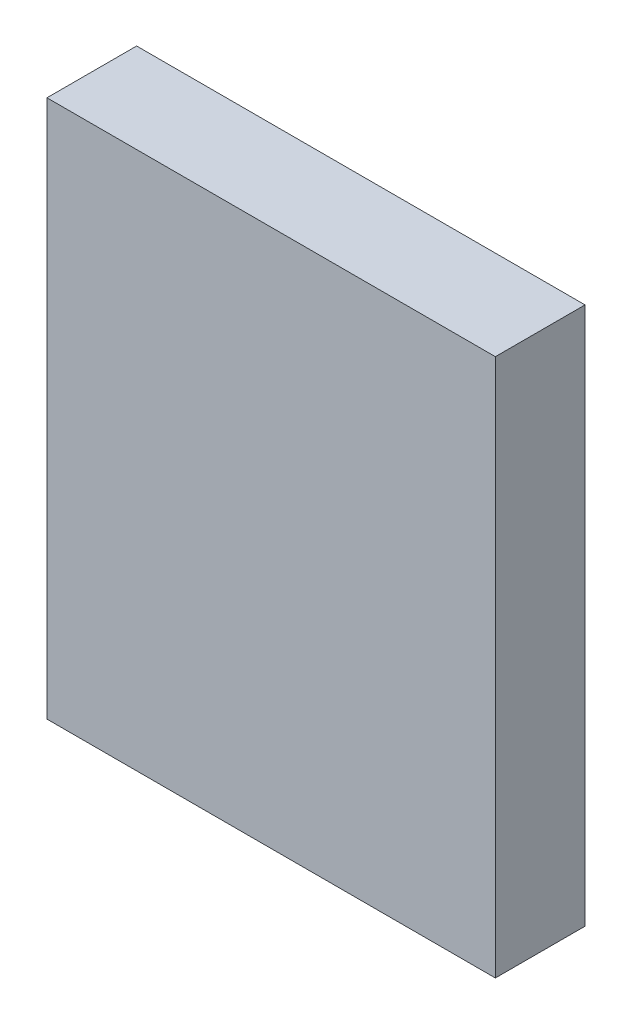
ISO-10303-21;
HEADER;
FILE_DESCRIPTION(('STEP AP214'),'2;1');
FILE_NAME('part.step','',(''),(''),'','','');
FILE_SCHEMA(('AUTOMOTIVE_DESIGN { 1 0 10303 214 1 1 1 1 }'));
ENDSEC;
DATA;
#1=APPLICATION_CONTEXT('core data for automotive mechanical design processes');
#2=APPLICATION_PROTOCOL_DEFINITION('international standard','automotive_design',2000,#1);
#3=PRODUCT_CONTEXT('',#1,'mechanical');
#4=PRODUCT('Part','Part','',(#3));
#5=PRODUCT_RELATED_PRODUCT_CATEGORY('part','',(#4));
#6=PRODUCT_DEFINITION_FORMATION('','',#4);
#7=PRODUCT_DEFINITION_CONTEXT('part definition',#1,'design');
#8=PRODUCT_DEFINITION('design','',#6,#7);
#9=PRODUCT_DEFINITION_SHAPE('','',#8);
#10=(LENGTH_UNIT() NAMED_UNIT(*) SI_UNIT(.MILLI.,.METRE.));
#11=(NAMED_UNIT(*) PLANE_ANGLE_UNIT() SI_UNIT($,.RADIAN.));
#12=(NAMED_UNIT(*) SI_UNIT($,.STERADIAN.) SOLID_ANGLE_UNIT());
#13=UNCERTAINTY_MEASURE_WITH_UNIT(LENGTH_MEASURE(1.E-05),#10,'distance_accuracy_value','');
#14=(GEOMETRIC_REPRESENTATION_CONTEXT(3) GLOBAL_UNCERTAINTY_ASSIGNED_CONTEXT((#13)) GLOBAL_UNIT_ASSIGNED_CONTEXT((#10,
#11,#12)) REPRESENTATION_CONTEXT('',''));
#15=CARTESIAN_POINT('',(0.,0.,0.));
#16=DIRECTION('',(0.,0.,1.));
#17=DIRECTION('',(1.,0.,0.));
#18=AXIS2_PLACEMENT_3D('',#15,#16,#17);
#19=CARTESIAN_POINT('',(50.,60.,2.));
#20=DIRECTION('',(0.,1.,0.));
#21=DIRECTION('',(0.,0.,1.));
#22=AXIS2_PLACEMENT_3D('',#19,#20,#21);
#23=PLANE('',#22);
#24=DIRECTION('',(-1.,0.,0.));
#25=VECTOR('',#24,1.);
#26=CARTESIAN_POINT('',(50.,60.,12.));
#27=LINE('',#26,#25);
#28=CARTESIAN_POINT('',(50.,60.,12.));
#29=VERTEX_POINT('',#28);
#30=CARTESIAN_POINT('',(0.,60.,12.));
#31=VERTEX_POINT('',#30);
#32=EDGE_CURVE('E98',#29,#31,#27,.T.);
#33=ORIENTED_EDGE('',*,*,#32,.F.);
#34=DIRECTION('',(0.,0.,1.));
#35=VECTOR('',#34,1.);
#36=CARTESIAN_POINT('',(50.,60.,2.));
#37=LINE('',#36,#35);
#38=CARTESIAN_POINT('',(50.,60.,2.));
#39=VERTEX_POINT('',#38);
#40=EDGE_CURVE('E11',#39,#29,#37,.T.);
#41=ORIENTED_EDGE('',*,*,#40,.F.);
#42=DIRECTION('',(-1.,0.,0.));
#43=VECTOR('',#42,1.);
#44=CARTESIAN_POINT('',(50.,60.,2.));
#45=LINE('',#44,#43);
#46=CARTESIAN_POINT('',(0.,60.,2.));
#47=VERTEX_POINT('',#46);
#48=EDGE_CURVE('E92',#39,#47,#45,.T.);
#49=ORIENTED_EDGE('',*,*,#48,.T.);
#50=DIRECTION('',(0.,0.,1.));
#51=VECTOR('',#50,1.);
#52=CARTESIAN_POINT('',(0.,60.,2.));
#53=LINE('',#52,#51);
#54=EDGE_CURVE('E37',#47,#31,#53,.T.);
#55=ORIENTED_EDGE('',*,*,#54,.T.);
#56=EDGE_LOOP('',(#33,#41,#49,#55));
#57=FACE_BOUND('',#56,.T.);
#58=ADVANCED_FACE('F34',(#57),#23,.T.);
#59=CARTESIAN_POINT('',(50.,0.,2.));
#60=DIRECTION('',(1.,0.,0.));
#61=DIRECTION('',(0.,0.,-1.));
#62=AXIS2_PLACEMENT_3D('',#59,#60,#61);
#63=PLANE('',#62);
#64=DIRECTION('',(0.,1.,0.));
#65=VECTOR('',#64,1.);
#66=CARTESIAN_POINT('',(50.,0.,12.));
#67=LINE('',#66,#65);
#68=CARTESIAN_POINT('',(50.,0.,12.));
#69=VERTEX_POINT('',#68);
#70=EDGE_CURVE('E94',#69,#29,#67,.T.);
#71=ORIENTED_EDGE('',*,*,#70,.F.);
#72=DIRECTION('',(0.,0.,1.));
#73=VECTOR('',#72,1.);
#74=CARTESIAN_POINT('',(50.,0.,2.));
#75=LINE('',#74,#73);
#76=CARTESIAN_POINT('',(50.,0.,2.));
#77=VERTEX_POINT('',#76);
#78=EDGE_CURVE('E43',#77,#69,#75,.T.);
#79=ORIENTED_EDGE('',*,*,#78,.F.);
#80=DIRECTION('',(0.,1.,0.));
#81=VECTOR('',#80,1.);
#82=CARTESIAN_POINT('',(50.,0.,2.));
#83=LINE('',#82,#81);
#84=EDGE_CURVE('E89',#77,#39,#83,.T.);
#85=ORIENTED_EDGE('',*,*,#84,.T.);
#86=ORIENTED_EDGE('',*,*,#40,.T.);
#87=EDGE_LOOP('',(#71,#79,#85,#86));
#88=FACE_BOUND('',#87,.T.);
#89=ADVANCED_FACE('F108',(#88),#63,.T.);
#90=CARTESIAN_POINT('',(0.,0.,2.));
#91=DIRECTION('',(0.,-1.,0.));
#92=DIRECTION('',(0.,0.,-1.));
#93=AXIS2_PLACEMENT_3D('',#90,#91,#92);
#94=PLANE('',#93);
#95=DIRECTION('',(1.,0.,0.));
#96=VECTOR('',#95,1.);
#97=CARTESIAN_POINT('',(0.,0.,12.));
#98=LINE('',#97,#96);
#99=CARTESIAN_POINT('',(0.,0.,12.));
#100=VERTEX_POINT('',#99);
#101=EDGE_CURVE('E84',#100,#69,#98,.T.);
#102=ORIENTED_EDGE('',*,*,#101,.F.);
#103=DIRECTION('',(0.,0.,1.));
#104=VECTOR('',#103,1.);
#105=CARTESIAN_POINT('',(0.,0.,2.));
#106=LINE('',#105,#104);
#107=CARTESIAN_POINT('',(0.,0.,2.));
#108=VERTEX_POINT('',#107);
#109=EDGE_CURVE('E79',#108,#100,#106,.T.);
#110=ORIENTED_EDGE('',*,*,#109,.F.);
#111=DIRECTION('',(1.,0.,0.));
#112=VECTOR('',#111,1.);
#113=CARTESIAN_POINT('',(0.,0.,2.));
#114=LINE('',#113,#112);
#115=EDGE_CURVE('E82',#108,#77,#114,.T.);
#116=ORIENTED_EDGE('',*,*,#115,.T.);
#117=ORIENTED_EDGE('',*,*,#78,.T.);
#118=EDGE_LOOP('',(#102,#110,#116,#117));
#119=FACE_BOUND('',#118,.T.);
#120=ADVANCED_FACE('F81',(#119),#94,.T.);
#121=CARTESIAN_POINT('',(0.,60.,2.));
#122=DIRECTION('',(-1.,0.,0.));
#123=DIRECTION('',(0.,0.,1.));
#124=AXIS2_PLACEMENT_3D('',#121,#122,#123);
#125=PLANE('',#124);
#126=DIRECTION('',(0.,-1.,0.));
#127=VECTOR('',#126,1.);
#128=CARTESIAN_POINT('',(0.,60.,12.));
#129=LINE('',#128,#127);
#130=EDGE_CURVE('E101',#31,#100,#129,.T.);
#131=ORIENTED_EDGE('',*,*,#130,.F.);
#132=ORIENTED_EDGE('',*,*,#54,.F.);
#133=DIRECTION('',(0.,-1.,0.));
#134=VECTOR('',#133,1.);
#135=CARTESIAN_POINT('',(0.,60.,2.));
#136=LINE('',#135,#134);
#137=EDGE_CURVE('E88',#47,#108,#136,.T.);
#138=ORIENTED_EDGE('',*,*,#137,.T.);
#139=ORIENTED_EDGE('',*,*,#109,.T.);
#140=EDGE_LOOP('',(#131,#132,#138,#139));
#141=FACE_BOUND('',#140,.T.);
#142=ADVANCED_FACE('F91',(#141),#125,.T.);
#143=CARTESIAN_POINT('',(0.,0.,2.));
#144=DIRECTION('',(0.,0.,1.));
#145=DIRECTION('',(1.,0.,0.));
#146=AXIS2_PLACEMENT_3D('',#143,#144,#145);
#147=PLANE('',#146);
#148=ORIENTED_EDGE('',*,*,#48,.F.);
#149=ORIENTED_EDGE('',*,*,#84,.F.);
#150=ORIENTED_EDGE('',*,*,#115,.F.);
#151=ORIENTED_EDGE('',*,*,#137,.F.);
#152=EDGE_LOOP('',(#148,#149,#150,#151));
#153=FACE_BOUND('',#152,.T.);
#154=ADVANCED_FACE('F87',(#153),#147,.F.);
#155=CARTESIAN_POINT('',(0.,0.,12.));
#156=DIRECTION('',(0.,0.,1.));
#157=DIRECTION('',(1.,0.,0.));
#158=AXIS2_PLACEMENT_3D('',#155,#156,#157);
#159=PLANE('',#158);
#160=ORIENTED_EDGE('',*,*,#32,.T.);
#161=ORIENTED_EDGE('',*,*,#130,.T.);
#162=ORIENTED_EDGE('',*,*,#101,.T.);
#163=ORIENTED_EDGE('',*,*,#70,.T.);
#164=EDGE_LOOP('',(#160,#161,#162,#163));
#165=FACE_BOUND('',#164,.T.);
#166=ADVANCED_FACE('F107',(#165),#159,.T.);
#167=CLOSED_SHELL('',(#58,#89,#120,#142,#154,#166));
#168=MANIFOLD_SOLID_BREP('B2',#167);
#169=ADVANCED_BREP_SHAPE_REPRESENTATION('',(#18,#168),#14);
#170=SHAPE_DEFINITION_REPRESENTATION(#9,#169);
ENDSEC;
END-ISO-10303-21;
